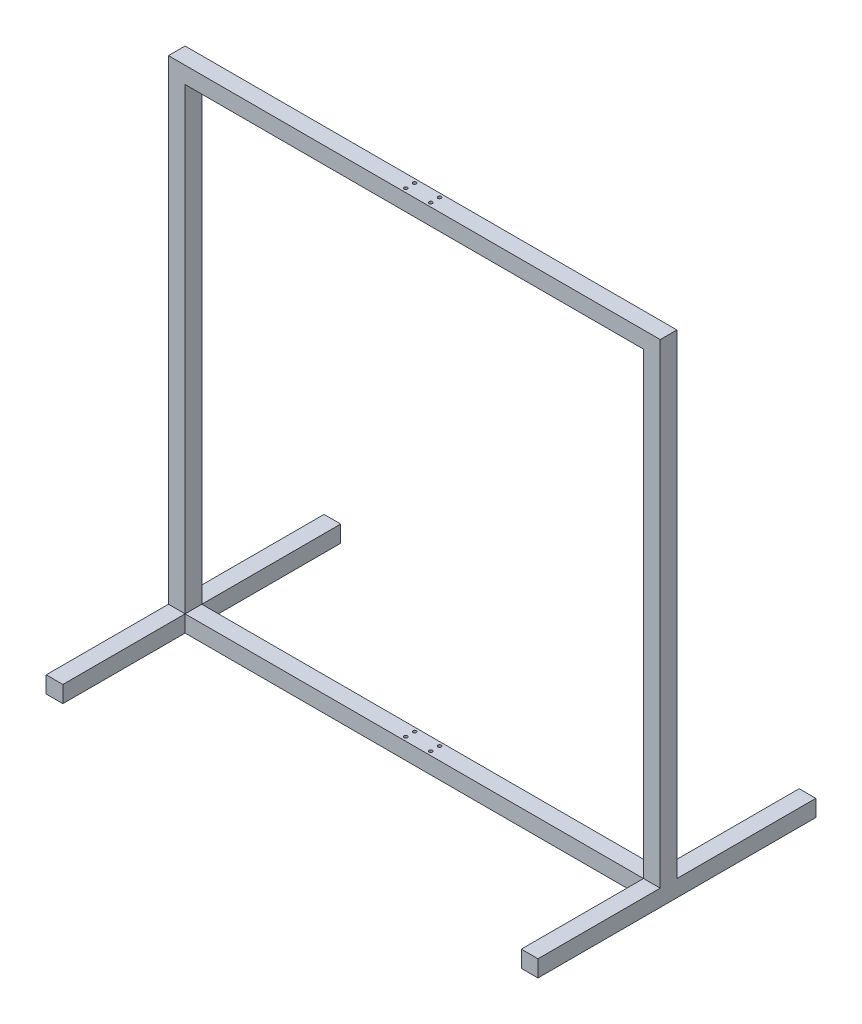
ISO-10303-21;
HEADER;
FILE_DESCRIPTION(('STEP AP214'),'2;1');
FILE_NAME('part.step','',(''),(''),'','','');
FILE_SCHEMA(('AUTOMOTIVE_DESIGN { 1 0 10303 214 1 1 1 1 }'));
ENDSEC;
DATA;
#1=APPLICATION_CONTEXT('core data for automotive mechanical design processes');
#2=APPLICATION_PROTOCOL_DEFINITION('international standard','automotive_design',2000,#1);
#3=PRODUCT_CONTEXT('',#1,'mechanical');
#4=PRODUCT('Part','Part','',(#3));
#5=PRODUCT_RELATED_PRODUCT_CATEGORY('part','',(#4));
#6=PRODUCT_DEFINITION_FORMATION('','',#4);
#7=PRODUCT_DEFINITION_CONTEXT('part definition',#1,'design');
#8=PRODUCT_DEFINITION('design','',#6,#7);
#9=PRODUCT_DEFINITION_SHAPE('','',#8);
#10=(LENGTH_UNIT() NAMED_UNIT(*) SI_UNIT(.MILLI.,.METRE.));
#11=(NAMED_UNIT(*) PLANE_ANGLE_UNIT() SI_UNIT($,.RADIAN.));
#12=(NAMED_UNIT(*) SI_UNIT($,.STERADIAN.) SOLID_ANGLE_UNIT());
#13=UNCERTAINTY_MEASURE_WITH_UNIT(LENGTH_MEASURE(1.E-05),#10,'distance_accuracy_value','');
#14=(GEOMETRIC_REPRESENTATION_CONTEXT(3) GLOBAL_UNCERTAINTY_ASSIGNED_CONTEXT((#13)) GLOBAL_UNIT_ASSIGNED_CONTEXT((#10,
#11,#12)) REPRESENTATION_CONTEXT('',''));
#15=CARTESIAN_POINT('',(0.,0.,0.));
#16=DIRECTION('',(0.,0.,1.));
#17=DIRECTION('',(1.,0.,0.));
#18=AXIS2_PLACEMENT_3D('',#15,#16,#17);
#19=CARTESIAN_POINT('',(-825.,825.,60.));
#20=DIRECTION('',(-1.,0.,0.));
#21=DIRECTION('',(0.,-1.,0.));
#22=AXIS2_PLACEMENT_3D('',#19,#20,#21);
#23=PLANE('',#22);
#24=DIRECTION('',(0.,-1.,0.));
#25=VECTOR('',#24,1.);
#26=CARTESIAN_POINT('',(-825.,-825.,60.));
#27=LINE('',#26,#25);
#28=CARTESIAN_POINT('',(-825.,-825.,60.));
#29=VERTEX_POINT('',#28);
#30=CARTESIAN_POINT('',(-825.,-885.,60.));
#31=VERTEX_POINT('',#30);
#32=EDGE_CURVE('E204',#29,#31,#27,.T.);
#33=ORIENTED_EDGE('',*,*,#32,.F.);
#34=DIRECTION('',(0.,0.,-1.));
#35=VECTOR('',#34,1.);
#36=CARTESIAN_POINT('',(-825.,-825.,500.));
#37=LINE('',#36,#35);
#38=CARTESIAN_POINT('',(-825.,-825.,500.));
#39=VERTEX_POINT('',#38);
#40=EDGE_CURVE('E171',#39,#29,#37,.T.);
#41=ORIENTED_EDGE('',*,*,#40,.F.);
#42=DIRECTION('',(0.,1.,0.));
#43=VECTOR('',#42,1.);
#44=CARTESIAN_POINT('',(-825.,-885.,500.));
#45=LINE('',#44,#43);
#46=CARTESIAN_POINT('',(-825.,-885.,500.));
#47=VERTEX_POINT('',#46);
#48=EDGE_CURVE('E273',#47,#39,#45,.T.);
#49=ORIENTED_EDGE('',*,*,#48,.F.);
#50=DIRECTION('',(0.,0.,-1.));
#51=VECTOR('',#50,1.);
#52=CARTESIAN_POINT('',(-825.,-885.,60.));
#53=LINE('',#52,#51);
#54=EDGE_CURVE('E63',#47,#31,#53,.T.);
#55=ORIENTED_EDGE('',*,*,#54,.T.);
#56=EDGE_LOOP('',(#33,#41,#49,#55));
#57=FACE_BOUND('',#56,.T.);
#58=ADVANCED_FACE('F38',(#57),#23,.F.);
#59=DIRECTION('',(0.,0.,1.));
#60=VECTOR('',#59,1.);
#61=CARTESIAN_POINT('',(-825.,-825.,0.));
#62=LINE('',#61,#60);
#63=CARTESIAN_POINT('',(-825.,-825.,0.));
#64=VERTEX_POINT('',#63);
#65=EDGE_CURVE('E197',#64,#29,#62,.T.);
#66=ORIENTED_EDGE('',*,*,#65,.F.);
#67=DIRECTION('',(0.,1.,0.));
#68=VECTOR('',#67,1.);
#69=CARTESIAN_POINT('',(-825.,825.,0.));
#70=LINE('',#69,#68);
#71=CARTESIAN_POINT('',(-825.,825.,0.));
#72=VERTEX_POINT('',#71);
#73=EDGE_CURVE('E184',#64,#72,#70,.T.);
#74=ORIENTED_EDGE('',*,*,#73,.T.);
#75=DIRECTION('',(0.,0.,-1.));
#76=VECTOR('',#75,1.);
#77=CARTESIAN_POINT('',(-825.,825.,60.));
#78=LINE('',#77,#76);
#79=CARTESIAN_POINT('',(-825.,825.,60.));
#80=VERTEX_POINT('',#79);
#81=EDGE_CURVE('E316',#80,#72,#78,.T.);
#82=ORIENTED_EDGE('',*,*,#81,.F.);
#83=DIRECTION('',(0.,1.,0.));
#84=VECTOR('',#83,1.);
#85=CARTESIAN_POINT('',(-825.,-825.,60.));
#86=LINE('',#85,#84);
#87=EDGE_CURVE('E200',#29,#80,#86,.T.);
#88=ORIENTED_EDGE('',*,*,#87,.F.);
#89=EDGE_LOOP('',(#66,#74,#82,#88));
#90=FACE_BOUND('',#89,.T.);
#91=ADVANCED_FACE('F199',(#90),#23,.F.);
#92=DIRECTION('',(0.,1.,0.));
#93=VECTOR('',#92,1.);
#94=CARTESIAN_POINT('',(-825.,-885.,0.));
#95=LINE('',#94,#93);
#96=CARTESIAN_POINT('',(-825.,-885.,0.));
#97=VERTEX_POINT('',#96);
#98=EDGE_CURVE('E55',#97,#64,#95,.T.);
#99=ORIENTED_EDGE('',*,*,#98,.F.);
#100=CARTESIAN_POINT('',(-825.,-885.,-500.));
#101=VERTEX_POINT('',#100);
#102=EDGE_CURVE('E318',#97,#101,#53,.T.);
#103=ORIENTED_EDGE('',*,*,#102,.T.);
#104=DIRECTION('',(0.,1.,0.));
#105=VECTOR('',#104,1.);
#106=CARTESIAN_POINT('',(-825.,-885.,-500.));
#107=LINE('',#106,#105);
#108=CARTESIAN_POINT('',(-825.,-825.,-500.));
#109=VERTEX_POINT('',#108);
#110=EDGE_CURVE('E167',#101,#109,#107,.T.);
#111=ORIENTED_EDGE('',*,*,#110,.T.);
#112=EDGE_CURVE('E163',#64,#109,#37,.T.);
#113=ORIENTED_EDGE('',*,*,#112,.F.);
#114=EDGE_LOOP('',(#99,#103,#111,#113));
#115=FACE_BOUND('',#114,.T.);
#116=ADVANCED_FACE('F165',(#115),#23,.F.);
#117=CARTESIAN_POINT('',(825.,825.,60.));
#118=DIRECTION('',(1.,0.,0.));
#119=DIRECTION('',(0.,1.,0.));
#120=AXIS2_PLACEMENT_3D('',#117,#118,#119);
#121=PLANE('',#120);
#122=DIRECTION('',(0.,1.,0.));
#123=VECTOR('',#122,1.);
#124=CARTESIAN_POINT('',(825.,825.,60.));
#125=LINE('',#124,#123);
#126=CARTESIAN_POINT('',(825.,-885.,60.));
#127=VERTEX_POINT('',#126);
#128=CARTESIAN_POINT('',(825.,-825.,60.));
#129=VERTEX_POINT('',#128);
#130=EDGE_CURVE('E226',#127,#129,#125,.T.);
#131=ORIENTED_EDGE('',*,*,#130,.F.);
#132=DIRECTION('',(0.,0.,-1.));
#133=VECTOR('',#132,1.);
#134=CARTESIAN_POINT('',(825.,-885.,60.));
#135=LINE('',#134,#133);
#136=CARTESIAN_POINT('',(825.,-885.,500.));
#137=VERTEX_POINT('',#136);
#138=EDGE_CURVE('E181',#137,#127,#135,.T.);
#139=ORIENTED_EDGE('',*,*,#138,.F.);
#140=DIRECTION('',(0.,-1.,0.));
#141=VECTOR('',#140,1.);
#142=CARTESIAN_POINT('',(825.,-885.,500.));
#143=LINE('',#142,#141);
#144=CARTESIAN_POINT('',(825.,-825.,500.));
#145=VERTEX_POINT('',#144);
#146=EDGE_CURVE('E244',#145,#137,#143,.T.);
#147=ORIENTED_EDGE('',*,*,#146,.F.);
#148=DIRECTION('',(0.,0.,-1.));
#149=VECTOR('',#148,1.);
#150=CARTESIAN_POINT('',(825.,-825.,500.));
#151=LINE('',#150,#149);
#152=EDGE_CURVE('E236',#145,#129,#151,.T.);
#153=ORIENTED_EDGE('',*,*,#152,.T.);
#154=EDGE_LOOP('',(#131,#139,#147,#153));
#155=FACE_BOUND('',#154,.T.);
#156=ADVANCED_FACE('F423',(#155),#121,.F.);
#157=DIRECTION('',(0.,0.,-1.));
#158=VECTOR('',#157,1.);
#159=CARTESIAN_POINT('',(825.,-824.999999999999,60.0000000000183));
#160=LINE('',#159,#158);
#161=CARTESIAN_POINT('',(825.,-825.,0.));
#162=VERTEX_POINT('',#161);
#163=EDGE_CURVE('E11',#129,#162,#160,.T.);
#164=ORIENTED_EDGE('',*,*,#163,.F.);
#165=DIRECTION('',(0.,-1.,0.));
#166=VECTOR('',#165,1.);
#167=CARTESIAN_POINT('',(825.,-825.,60.));
#168=LINE('',#167,#166);
#169=CARTESIAN_POINT('',(825.,825.,60.));
#170=VERTEX_POINT('',#169);
#171=EDGE_CURVE('E291',#170,#129,#168,.T.);
#172=ORIENTED_EDGE('',*,*,#171,.F.);
#173=DIRECTION('',(0.,0.,-1.));
#174=VECTOR('',#173,1.);
#175=CARTESIAN_POINT('',(825.,825.,60.));
#176=LINE('',#175,#174);
#177=CARTESIAN_POINT('',(825.,825.,0.));
#178=VERTEX_POINT('',#177);
#179=EDGE_CURVE('E306',#170,#178,#176,.T.);
#180=ORIENTED_EDGE('',*,*,#179,.T.);
#181=DIRECTION('',(0.,-1.,0.));
#182=VECTOR('',#181,1.);
#183=CARTESIAN_POINT('',(825.,825.,0.));
#184=LINE('',#183,#182);
#185=EDGE_CURVE('E295',#178,#162,#184,.T.);
#186=ORIENTED_EDGE('',*,*,#185,.T.);
#187=EDGE_LOOP('',(#164,#172,#180,#186));
#188=FACE_BOUND('',#187,.T.);
#189=ADVANCED_FACE('F398',(#188),#121,.F.);
#190=DIRECTION('',(0.,-1.,0.));
#191=VECTOR('',#190,1.);
#192=CARTESIAN_POINT('',(825.,825.,0.));
#193=LINE('',#192,#191);
#194=CARTESIAN_POINT('',(825.,-885.,0.));
#195=VERTEX_POINT('',#194);
#196=EDGE_CURVE('E229',#162,#195,#193,.T.);
#197=ORIENTED_EDGE('',*,*,#196,.F.);
#198=CARTESIAN_POINT('',(825.,-825.,-500.));
#199=VERTEX_POINT('',#198);
#200=EDGE_CURVE('E235',#162,#199,#151,.T.);
#201=ORIENTED_EDGE('',*,*,#200,.T.);
#202=DIRECTION('',(0.,-1.,0.));
#203=VECTOR('',#202,1.);
#204=CARTESIAN_POINT('',(825.,-885.,-500.));
#205=LINE('',#204,#203);
#206=CARTESIAN_POINT('',(825.,-885.,-500.));
#207=VERTEX_POINT('',#206);
#208=EDGE_CURVE('E250',#199,#207,#205,.T.);
#209=ORIENTED_EDGE('',*,*,#208,.T.);
#210=EDGE_CURVE('E330',#195,#207,#135,.T.);
#211=ORIENTED_EDGE('',*,*,#210,.F.);
#212=EDGE_LOOP('',(#197,#201,#209,#211));
#213=FACE_BOUND('',#212,.T.);
#214=ADVANCED_FACE('F404',(#213),#121,.F.);
#215=CARTESIAN_POINT('',(0.,0.,60.));
#216=DIRECTION('',(0.,0.,1.));
#217=DIRECTION('',(1.,0.,0.));
#218=AXIS2_PLACEMENT_3D('',#215,#216,#217);
#219=PLANE('',#218);
#220=ORIENTED_EDGE('',*,*,#171,.T.);
#221=DIRECTION('',(1.,0.,0.));
#222=VECTOR('',#221,1.);
#223=CARTESIAN_POINT('',(-1.52655665885957E-12,-824.999999999998,60.));
#224=LINE('',#223,#222);
#225=CARTESIAN_POINT('',(885.,-824.999999999999,60.));
#226=VERTEX_POINT('',#225);
#227=EDGE_CURVE('E263',#129,#226,#224,.T.);
#228=ORIENTED_EDGE('',*,*,#227,.T.);
#229=DIRECTION('',(0.,1.,0.));
#230=VECTOR('',#229,1.);
#231=CARTESIAN_POINT('',(885.,885.,60.));
#232=LINE('',#231,#230);
#233=CARTESIAN_POINT('',(885.,885.,60.));
#234=VERTEX_POINT('',#233);
#235=EDGE_CURVE('E294',#226,#234,#232,.T.);
#236=ORIENTED_EDGE('',*,*,#235,.T.);
#237=DIRECTION('',(-1.,0.,0.));
#238=VECTOR('',#237,1.);
#239=CARTESIAN_POINT('',(-885.,885.,60.));
#240=LINE('',#239,#238);
#241=CARTESIAN_POINT('',(-885.,885.,60.));
#242=VERTEX_POINT('',#241);
#243=EDGE_CURVE('E297',#234,#242,#240,.T.);
#244=ORIENTED_EDGE('',*,*,#243,.T.);
#245=DIRECTION('',(0.,-1.,0.));
#246=VECTOR('',#245,1.);
#247=CARTESIAN_POINT('',(-885.,885.,60.));
#248=LINE('',#247,#246);
#249=CARTESIAN_POINT('',(-885.,-825.,60.));
#250=VERTEX_POINT('',#249);
#251=EDGE_CURVE('E299',#242,#250,#248,.T.);
#252=ORIENTED_EDGE('',*,*,#251,.T.);
#253=DIRECTION('',(1.,0.,0.));
#254=VECTOR('',#253,1.);
#255=CARTESIAN_POINT('',(0.,-825.,60.));
#256=LINE('',#255,#254);
#257=EDGE_CURVE('E287',#250,#29,#256,.T.);
#258=ORIENTED_EDGE('',*,*,#257,.T.);
#259=ORIENTED_EDGE('',*,*,#87,.T.);
#260=DIRECTION('',(1.,0.,0.));
#261=VECTOR('',#260,1.);
#262=CARTESIAN_POINT('',(-825.,825.,60.));
#263=LINE('',#262,#261);
#264=EDGE_CURVE('E303',#80,#170,#263,.T.);
#265=ORIENTED_EDGE('',*,*,#264,.T.);
#266=EDGE_LOOP('',(#220,#228,#236,#244,#252,#258,#259,#265));
#267=FACE_BOUND('',#266,.T.);
#268=ADVANCED_FACE('F389',(#267),#219,.T.);
#269=CARTESIAN_POINT('',(0.,0.,0.));
#270=DIRECTION('',(0.,0.,1.));
#271=DIRECTION('',(1.,0.,0.));
#272=AXIS2_PLACEMENT_3D('',#269,#270,#271);
#273=PLANE('',#272);
#274=DIRECTION('',(1.,0.,0.));
#275=VECTOR('',#274,1.);
#276=CARTESIAN_POINT('',(-1.52655665885957E-12,-824.999999999998,0.));
#277=LINE('',#276,#275);
#278=CARTESIAN_POINT('',(885.,-825.,0.));
#279=VERTEX_POINT('',#278);
#280=EDGE_CURVE('E253',#162,#279,#277,.T.);
#281=ORIENTED_EDGE('',*,*,#280,.F.);
#282=ORIENTED_EDGE('',*,*,#185,.F.);
#283=DIRECTION('',(1.,0.,0.));
#284=VECTOR('',#283,1.);
#285=CARTESIAN_POINT('',(-825.,825.,0.));
#286=LINE('',#285,#284);
#287=EDGE_CURVE('E189',#72,#178,#286,.T.);
#288=ORIENTED_EDGE('',*,*,#287,.F.);
#289=ORIENTED_EDGE('',*,*,#73,.F.);
#290=DIRECTION('',(1.,0.,0.));
#291=VECTOR('',#290,1.);
#292=CARTESIAN_POINT('',(0.,-825.,0.));
#293=LINE('',#292,#291);
#294=CARTESIAN_POINT('',(-885.,-825.,0.));
#295=VERTEX_POINT('',#294);
#296=EDGE_CURVE('E47',#295,#64,#293,.T.);
#297=ORIENTED_EDGE('',*,*,#296,.F.);
#298=DIRECTION('',(0.,-1.,0.));
#299=VECTOR('',#298,1.);
#300=CARTESIAN_POINT('',(-885.,885.,0.));
#301=LINE('',#300,#299);
#302=CARTESIAN_POINT('',(-885.,885.,0.));
#303=VERTEX_POINT('',#302);
#304=EDGE_CURVE('E193',#303,#295,#301,.T.);
#305=ORIENTED_EDGE('',*,*,#304,.F.);
#306=DIRECTION('',(-1.,0.,0.));
#307=VECTOR('',#306,1.);
#308=CARTESIAN_POINT('',(-885.,885.,0.));
#309=LINE('',#308,#307);
#310=CARTESIAN_POINT('',(885.,885.,0.));
#311=VERTEX_POINT('',#310);
#312=EDGE_CURVE('E308',#311,#303,#309,.T.);
#313=ORIENTED_EDGE('',*,*,#312,.F.);
#314=DIRECTION('',(0.,1.,0.));
#315=VECTOR('',#314,1.);
#316=CARTESIAN_POINT('',(885.,885.,0.));
#317=LINE('',#316,#315);
#318=EDGE_CURVE('E290',#279,#311,#317,.T.);
#319=ORIENTED_EDGE('',*,*,#318,.F.);
#320=EDGE_LOOP('',(#281,#282,#288,#289,#297,#305,#313,#319));
#321=FACE_BOUND('',#320,.T.);
#322=ADVANCED_FACE('F187',(#321),#273,.F.);
#323=CARTESIAN_POINT('',(885.,885.,60.));
#324=DIRECTION('',(-1.,0.,0.));
#325=DIRECTION('',(0.,-1.,0.));
#326=AXIS2_PLACEMENT_3D('',#323,#324,#325);
#327=PLANE('',#326);
#328=DIRECTION('',(0.,0.,-1.));
#329=VECTOR('',#328,1.);
#330=CARTESIAN_POINT('',(885.,-885.,60.));
#331=LINE('',#330,#329);
#332=CARTESIAN_POINT('',(885.,-885.,500.));
#333=VERTEX_POINT('',#332);
#334=CARTESIAN_POINT('',(885.,-885.,-500.));
#335=VERTEX_POINT('',#334);
#336=EDGE_CURVE('E328',#333,#335,#331,.T.);
#337=ORIENTED_EDGE('',*,*,#336,.T.);
#338=DIRECTION('',(0.,1.,0.));
#339=VECTOR('',#338,1.);
#340=CARTESIAN_POINT('',(885.,-825.,-500.));
#341=LINE('',#340,#339);
#342=CARTESIAN_POINT('',(885.,-825.,-500.));
#343=VERTEX_POINT('',#342);
#344=EDGE_CURVE('E243',#335,#343,#341,.T.);
#345=ORIENTED_EDGE('',*,*,#344,.T.);
#346=DIRECTION('',(0.,0.,-1.));
#347=VECTOR('',#346,1.);
#348=CARTESIAN_POINT('',(885.,-825.,500.));
#349=LINE('',#348,#347);
#350=EDGE_CURVE('E231',#279,#343,#349,.T.);
#351=ORIENTED_EDGE('',*,*,#350,.F.);
#352=ORIENTED_EDGE('',*,*,#318,.T.);
#353=DIRECTION('',(0.,0.,-1.));
#354=VECTOR('',#353,1.);
#355=CARTESIAN_POINT('',(885.,885.,60.));
#356=LINE('',#355,#354);
#357=EDGE_CURVE('E325',#234,#311,#356,.T.);
#358=ORIENTED_EDGE('',*,*,#357,.F.);
#359=ORIENTED_EDGE('',*,*,#235,.F.);
#360=CARTESIAN_POINT('',(885.,-825.,500.));
#361=VERTEX_POINT('',#360);
#362=EDGE_CURVE('E232',#361,#226,#349,.T.);
#363=ORIENTED_EDGE('',*,*,#362,.F.);
#364=DIRECTION('',(0.,1.,0.));
#365=VECTOR('',#364,1.);
#366=CARTESIAN_POINT('',(885.,-825.,500.));
#367=LINE('',#366,#365);
#368=EDGE_CURVE('E255',#333,#361,#367,.T.);
#369=ORIENTED_EDGE('',*,*,#368,.F.);
#370=EDGE_LOOP('',(#337,#345,#351,#352,#358,#359,#363,#369));
#371=FACE_BOUND('',#370,.T.);
#372=ADVANCED_FACE('F40',(#371),#327,.F.);
#373=CARTESIAN_POINT('',(-885.,885.,60.));
#374=DIRECTION('',(0.,-1.,0.));
#375=DIRECTION('',(0.,0.,-1.));
#376=AXIS2_PLACEMENT_3D('',#373,#374,#375);
#377=PLANE('',#376);
#378=CARTESIAN_POINT('',(-45.,885.,14.));
#379=DIRECTION('',(0.,-1.,0.));
#380=DIRECTION('',(0.,0.,-1.));
#381=AXIS2_PLACEMENT_3D('',#378,#379,#380);
#382=CIRCLE('',#381,6.);
#383=CARTESIAN_POINT('',(-45.,885.,8.00000000000004));
#384=VERTEX_POINT('',#383);
#385=EDGE_CURVE('E205',#384,#384,#382,.F.);
#386=ORIENTED_EDGE('',*,*,#385,.F.);
#387=EDGE_LOOP('',(#386));
#388=FACE_BOUND('',#387,.T.);
#389=CARTESIAN_POINT('',(45.,885.,46.0000000000001));
#390=DIRECTION('',(0.,-1.,0.));
#391=DIRECTION('',(0.,0.,-1.));
#392=AXIS2_PLACEMENT_3D('',#389,#390,#391);
#393=CIRCLE('',#392,6.);
#394=CARTESIAN_POINT('',(45.,885.,40.));
#395=VERTEX_POINT('',#394);
#396=EDGE_CURVE('E349',#395,#395,#393,.F.);
#397=ORIENTED_EDGE('',*,*,#396,.F.);
#398=EDGE_LOOP('',(#397));
#399=FACE_BOUND('',#398,.T.);
#400=CARTESIAN_POINT('',(45.,885.,14.0000000000001));
#401=DIRECTION('',(0.,-1.,0.));
#402=DIRECTION('',(0.,0.,-1.));
#403=AXIS2_PLACEMENT_3D('',#400,#401,#402);
#404=CIRCLE('',#403,6.);
#405=CARTESIAN_POINT('',(45.,885.,8.00000000000005));
#406=VERTEX_POINT('',#405);
#407=EDGE_CURVE('E345',#406,#406,#404,.F.);
#408=ORIENTED_EDGE('',*,*,#407,.F.);
#409=EDGE_LOOP('',(#408));
#410=FACE_BOUND('',#409,.T.);
#411=CARTESIAN_POINT('',(-45.,885.,46.));
#412=DIRECTION('',(0.,-1.,0.));
#413=DIRECTION('',(0.,0.,-1.));
#414=AXIS2_PLACEMENT_3D('',#411,#412,#413);
#415=CIRCLE('',#414,6.);
#416=CARTESIAN_POINT('',(-45.,885.,40.));
#417=VERTEX_POINT('',#416);
#418=EDGE_CURVE('E341',#417,#417,#415,.F.);
#419=ORIENTED_EDGE('',*,*,#418,.F.);
#420=EDGE_LOOP('',(#419));
#421=FACE_BOUND('',#420,.T.);
#422=ORIENTED_EDGE('',*,*,#312,.T.);
#423=DIRECTION('',(0.,0.,-1.));
#424=VECTOR('',#423,1.);
#425=CARTESIAN_POINT('',(-885.,885.,60.));
#426=LINE('',#425,#424);
#427=EDGE_CURVE('E322',#242,#303,#426,.T.);
#428=ORIENTED_EDGE('',*,*,#427,.F.);
#429=ORIENTED_EDGE('',*,*,#243,.F.);
#430=ORIENTED_EDGE('',*,*,#357,.T.);
#431=EDGE_LOOP('',(#422,#428,#429,#430));
#432=FACE_BOUND('',#431,.T.);
#433=ADVANCED_FACE('F369',(#388,#399,#410,#421,#432),#377,.F.);
#434=CARTESIAN_POINT('',(-885.,885.,60.));
#435=DIRECTION('',(1.,0.,0.));
#436=DIRECTION('',(0.,1.,0.));
#437=AXIS2_PLACEMENT_3D('',#434,#435,#436);
#438=PLANE('',#437);
#439=DIRECTION('',(0.,0.,-1.));
#440=VECTOR('',#439,1.);
#441=CARTESIAN_POINT('',(-885.,-885.,60.));
#442=LINE('',#441,#440);
#443=CARTESIAN_POINT('',(-885.,-885.,500.));
#444=VERTEX_POINT('',#443);
#445=CARTESIAN_POINT('',(-885.,-885.,-500.));
#446=VERTEX_POINT('',#445);
#447=EDGE_CURVE('E320',#444,#446,#442,.T.);
#448=ORIENTED_EDGE('',*,*,#447,.F.);
#449=DIRECTION('',(0.,-1.,0.));
#450=VECTOR('',#449,1.);
#451=CARTESIAN_POINT('',(-885.,-825.,500.));
#452=LINE('',#451,#450);
#453=CARTESIAN_POINT('',(-885.,-825.,500.));
#454=VERTEX_POINT('',#453);
#455=EDGE_CURVE('E266',#454,#444,#452,.T.);
#456=ORIENTED_EDGE('',*,*,#455,.F.);
#457=DIRECTION('',(0.,0.,-1.));
#458=VECTOR('',#457,1.);
#459=CARTESIAN_POINT('',(-885.,-825.,500.));
#460=LINE('',#459,#458);
#461=EDGE_CURVE('E172',#454,#250,#460,.T.);
#462=ORIENTED_EDGE('',*,*,#461,.T.);
#463=ORIENTED_EDGE('',*,*,#251,.F.);
#464=ORIENTED_EDGE('',*,*,#427,.T.);
#465=ORIENTED_EDGE('',*,*,#304,.T.);
#466=CARTESIAN_POINT('',(-885.,-825.,-500.));
#467=VERTEX_POINT('',#466);
#468=EDGE_CURVE('E177',#295,#467,#460,.T.);
#469=ORIENTED_EDGE('',*,*,#468,.T.);
#470=DIRECTION('',(0.,-1.,0.));
#471=VECTOR('',#470,1.);
#472=CARTESIAN_POINT('',(-885.,-825.,-500.));
#473=LINE('',#472,#471);
#474=EDGE_CURVE('E265',#467,#446,#473,.T.);
#475=ORIENTED_EDGE('',*,*,#474,.T.);
#476=EDGE_LOOP('',(#448,#456,#462,#463,#464,#465,#469,#475));
#477=FACE_BOUND('',#476,.T.);
#478=ADVANCED_FACE('F372',(#477),#438,.F.);
#479=CARTESIAN_POINT('',(-885.,-885.,60.));
#480=DIRECTION('',(0.,1.,0.));
#481=DIRECTION('',(0.,0.,1.));
#482=AXIS2_PLACEMENT_3D('',#479,#480,#481);
#483=PLANE('',#482);
#484=CARTESIAN_POINT('',(-45.,-885.,14.));
#485=DIRECTION('',(0.,-1.,0.));
#486=DIRECTION('',(0.,0.,-1.));
#487=AXIS2_PLACEMENT_3D('',#484,#485,#486);
#488=CIRCLE('',#487,6.);
#489=CARTESIAN_POINT('',(-45.,-885.,8.00000000000004));
#490=VERTEX_POINT('',#489);
#491=EDGE_CURVE('E529',#490,#490,#488,.T.);
#492=ORIENTED_EDGE('',*,*,#491,.F.);
#493=EDGE_LOOP('',(#492));
#494=FACE_BOUND('',#493,.T.);
#495=CARTESIAN_POINT('',(45.,-885.,46.0000000000001));
#496=DIRECTION('',(0.,-1.,0.));
#497=DIRECTION('',(0.,0.,-1.));
#498=AXIS2_PLACEMENT_3D('',#495,#496,#497);
#499=CIRCLE('',#498,6.);
#500=CARTESIAN_POINT('',(45.,-885.,40.));
#501=VERTEX_POINT('',#500);
#502=EDGE_CURVE('E526',#501,#501,#499,.T.);
#503=ORIENTED_EDGE('',*,*,#502,.F.);
#504=EDGE_LOOP('',(#503));
#505=FACE_BOUND('',#504,.T.);
#506=CARTESIAN_POINT('',(45.,-885.,14.0000000000001));
#507=DIRECTION('',(0.,-1.,0.));
#508=DIRECTION('',(0.,0.,-1.));
#509=AXIS2_PLACEMENT_3D('',#506,#507,#508);
#510=CIRCLE('',#509,6.);
#511=CARTESIAN_POINT('',(45.,-885.,8.00000000000005));
#512=VERTEX_POINT('',#511);
#513=EDGE_CURVE('E519',#512,#512,#510,.T.);
#514=ORIENTED_EDGE('',*,*,#513,.F.);
#515=EDGE_LOOP('',(#514));
#516=FACE_BOUND('',#515,.T.);
#517=CARTESIAN_POINT('',(-45.,-885.,46.));
#518=DIRECTION('',(0.,-1.,0.));
#519=DIRECTION('',(0.,0.,-1.));
#520=AXIS2_PLACEMENT_3D('',#517,#518,#519);
#521=CIRCLE('',#520,6.);
#522=CARTESIAN_POINT('',(-45.,-885.,40.));
#523=VERTEX_POINT('',#522);
#524=EDGE_CURVE('E337',#523,#523,#521,.T.);
#525=ORIENTED_EDGE('',*,*,#524,.F.);
#526=EDGE_LOOP('',(#525));
#527=FACE_BOUND('',#526,.T.);
#528=ORIENTED_EDGE('',*,*,#138,.T.);
#529=DIRECTION('',(-1.,0.,0.));
#530=VECTOR('',#529,1.);
#531=CARTESIAN_POINT('',(877.999999999997,-885.,60.));
#532=LINE('',#531,#530);
#533=EDGE_CURVE('E222',#127,#31,#532,.T.);
#534=ORIENTED_EDGE('',*,*,#533,.T.);
#535=ORIENTED_EDGE('',*,*,#54,.F.);
#536=DIRECTION('',(1.,0.,0.));
#537=VECTOR('',#536,1.);
#538=CARTESIAN_POINT('',(-885.,-885.,500.));
#539=LINE('',#538,#537);
#540=EDGE_CURVE('E269',#444,#47,#539,.T.);
#541=ORIENTED_EDGE('',*,*,#540,.F.);
#542=ORIENTED_EDGE('',*,*,#447,.T.);
#543=DIRECTION('',(1.,0.,0.));
#544=VECTOR('',#543,1.);
#545=CARTESIAN_POINT('',(-885.,-885.,-500.));
#546=LINE('',#545,#544);
#547=EDGE_CURVE('E279',#446,#101,#546,.T.);
#548=ORIENTED_EDGE('',*,*,#547,.T.);
#549=ORIENTED_EDGE('',*,*,#102,.F.);
#550=DIRECTION('',(-1.,0.,0.));
#551=VECTOR('',#550,1.);
#552=CARTESIAN_POINT('',(877.999999999997,-885.,0.));
#553=LINE('',#552,#551);
#554=EDGE_CURVE('E212',#195,#97,#553,.T.);
#555=ORIENTED_EDGE('',*,*,#554,.F.);
#556=ORIENTED_EDGE('',*,*,#210,.T.);
#557=DIRECTION('',(1.,0.,0.));
#558=VECTOR('',#557,1.);
#559=CARTESIAN_POINT('',(885.,-885.,-500.));
#560=LINE('',#559,#558);
#561=EDGE_CURVE('E247',#207,#335,#560,.T.);
#562=ORIENTED_EDGE('',*,*,#561,.T.);
#563=ORIENTED_EDGE('',*,*,#336,.F.);
#564=DIRECTION('',(1.,0.,0.));
#565=VECTOR('',#564,1.);
#566=CARTESIAN_POINT('',(885.,-885.,500.));
#567=LINE('',#566,#565);
#568=EDGE_CURVE('E257',#137,#333,#567,.T.);
#569=ORIENTED_EDGE('',*,*,#568,.F.);
#570=EDGE_LOOP('',(#528,#534,#535,#541,#542,#548,#549,#555,#556,#562,#563,#569));
#571=FACE_BOUND('',#570,.T.);
#572=ADVANCED_FACE('F406',(#494,#505,#516,#527,#571),#483,.F.);
#573=CARTESIAN_POINT('',(-825.,825.,60.));
#574=DIRECTION('',(0.,1.,0.));
#575=DIRECTION('',(0.,0.,1.));
#576=AXIS2_PLACEMENT_3D('',#573,#574,#575);
#577=PLANE('',#576);
#578=CARTESIAN_POINT('',(-45.,825.,14.));
#579=DIRECTION('',(0.,1.,0.));
#580=DIRECTION('',(0.,0.,1.));
#581=AXIS2_PLACEMENT_3D('',#578,#579,#580);
#582=CIRCLE('',#581,6.);
#583=CARTESIAN_POINT('',(-45.,825.,20.0000000000001));
#584=VERTEX_POINT('',#583);
#585=EDGE_CURVE('E361',#584,#584,#582,.F.);
#586=ORIENTED_EDGE('',*,*,#585,.F.);
#587=EDGE_LOOP('',(#586));
#588=FACE_BOUND('',#587,.T.);
#589=CARTESIAN_POINT('',(45.,825.,46.0000000000001));
#590=DIRECTION('',(0.,1.,0.));
#591=DIRECTION('',(0.,0.,1.));
#592=AXIS2_PLACEMENT_3D('',#589,#590,#591);
#593=CIRCLE('',#592,6.);
#594=CARTESIAN_POINT('',(45.,825.,52.0000000000001));
#595=VERTEX_POINT('',#594);
#596=EDGE_CURVE('E344',#595,#595,#593,.F.);
#597=ORIENTED_EDGE('',*,*,#596,.F.);
#598=EDGE_LOOP('',(#597));
#599=FACE_BOUND('',#598,.T.);
#600=CARTESIAN_POINT('',(45.,825.,14.0000000000001));
#601=DIRECTION('',(0.,1.,0.));
#602=DIRECTION('',(0.,0.,1.));
#603=AXIS2_PLACEMENT_3D('',#600,#601,#602);
#604=CIRCLE('',#603,6.);
#605=CARTESIAN_POINT('',(45.,825.,20.0000000000001));
#606=VERTEX_POINT('',#605);
#607=EDGE_CURVE('E340',#606,#606,#604,.F.);
#608=ORIENTED_EDGE('',*,*,#607,.F.);
#609=EDGE_LOOP('',(#608));
#610=FACE_BOUND('',#609,.T.);
#611=CARTESIAN_POINT('',(-45.,825.,46.));
#612=DIRECTION('',(0.,1.,0.));
#613=DIRECTION('',(0.,0.,1.));
#614=AXIS2_PLACEMENT_3D('',#611,#612,#613);
#615=CIRCLE('',#614,6.);
#616=CARTESIAN_POINT('',(-45.,825.,52.));
#617=VERTEX_POINT('',#616);
#618=EDGE_CURVE('E336',#617,#617,#615,.F.);
#619=ORIENTED_EDGE('',*,*,#618,.F.);
#620=EDGE_LOOP('',(#619));
#621=FACE_BOUND('',#620,.T.);
#622=ORIENTED_EDGE('',*,*,#287,.T.);
#623=ORIENTED_EDGE('',*,*,#179,.F.);
#624=ORIENTED_EDGE('',*,*,#264,.F.);
#625=ORIENTED_EDGE('',*,*,#81,.T.);
#626=EDGE_LOOP('',(#622,#623,#624,#625));
#627=FACE_BOUND('',#626,.T.);
#628=ADVANCED_FACE('F474',(#588,#599,#610,#621,#627),#577,.F.);
#629=CARTESIAN_POINT('',(0.,0.,-500.));
#630=DIRECTION('',(0.,0.,1.));
#631=DIRECTION('',(1.,0.,0.));
#632=AXIS2_PLACEMENT_3D('',#629,#630,#631);
#633=PLANE('',#632);
#634=ORIENTED_EDGE('',*,*,#474,.F.);
#635=DIRECTION('',(-1.,0.,0.));
#636=VECTOR('',#635,1.);
#637=CARTESIAN_POINT('',(-885.,-825.,-500.));
#638=LINE('',#637,#636);
#639=EDGE_CURVE('E270',#109,#467,#638,.T.);
#640=ORIENTED_EDGE('',*,*,#639,.F.);
#641=ORIENTED_EDGE('',*,*,#110,.F.);
#642=ORIENTED_EDGE('',*,*,#547,.F.);
#643=EDGE_LOOP('',(#634,#640,#641,#642));
#644=FACE_BOUND('',#643,.T.);
#645=ADVANCED_FACE('F412',(#644),#633,.F.);
#646=CARTESIAN_POINT('',(-885.,-825.,500.));
#647=DIRECTION('',(0.,-1.,0.));
#648=DIRECTION('',(0.,0.,-1.));
#649=AXIS2_PLACEMENT_3D('',#646,#647,#648);
#650=PLANE('',#649);
#651=ORIENTED_EDGE('',*,*,#468,.F.);
#652=ORIENTED_EDGE('',*,*,#296,.T.);
#653=ORIENTED_EDGE('',*,*,#112,.T.);
#654=ORIENTED_EDGE('',*,*,#639,.T.);
#655=EDGE_LOOP('',(#651,#652,#653,#654));
#656=FACE_BOUND('',#655,.T.);
#657=ADVANCED_FACE('F176',(#656),#650,.F.);
#658=ORIENTED_EDGE('',*,*,#257,.F.);
#659=ORIENTED_EDGE('',*,*,#461,.F.);
#660=DIRECTION('',(-1.,0.,0.));
#661=VECTOR('',#660,1.);
#662=CARTESIAN_POINT('',(-885.,-825.,500.));
#663=LINE('',#662,#661);
#664=EDGE_CURVE('E275',#39,#454,#663,.T.);
#665=ORIENTED_EDGE('',*,*,#664,.F.);
#666=ORIENTED_EDGE('',*,*,#40,.T.);
#667=EDGE_LOOP('',(#658,#659,#665,#666));
#668=FACE_BOUND('',#667,.T.);
#669=ADVANCED_FACE('F418',(#668),#650,.F.);
#670=CARTESIAN_POINT('',(0.,0.,500.));
#671=DIRECTION('',(0.,0.,1.));
#672=DIRECTION('',(1.,0.,0.));
#673=AXIS2_PLACEMENT_3D('',#670,#671,#672);
#674=PLANE('',#673);
#675=ORIENTED_EDGE('',*,*,#455,.T.);
#676=ORIENTED_EDGE('',*,*,#540,.T.);
#677=ORIENTED_EDGE('',*,*,#48,.T.);
#678=ORIENTED_EDGE('',*,*,#664,.T.);
#679=EDGE_LOOP('',(#675,#676,#677,#678));
#680=FACE_BOUND('',#679,.T.);
#681=ADVANCED_FACE('F414',(#680),#674,.T.);
#682=CARTESIAN_POINT('',(0.,0.,-500.));
#683=DIRECTION('',(0.,0.,-1.));
#684=DIRECTION('',(-1.,0.,0.));
#685=AXIS2_PLACEMENT_3D('',#682,#683,#684);
#686=PLANE('',#685);
#687=ORIENTED_EDGE('',*,*,#208,.F.);
#688=DIRECTION('',(-1.,0.,0.));
#689=VECTOR('',#688,1.);
#690=CARTESIAN_POINT('',(825.,-825.,-500.));
#691=LINE('',#690,#689);
#692=EDGE_CURVE('E240',#343,#199,#691,.T.);
#693=ORIENTED_EDGE('',*,*,#692,.F.);
#694=ORIENTED_EDGE('',*,*,#344,.F.);
#695=ORIENTED_EDGE('',*,*,#561,.F.);
#696=EDGE_LOOP('',(#687,#693,#694,#695));
#697=FACE_BOUND('',#696,.T.);
#698=ADVANCED_FACE('F435',(#697),#686,.T.);
#699=CARTESIAN_POINT('',(825.,-825.,500.));
#700=DIRECTION('',(0.,-1.,0.));
#701=DIRECTION('',(1.,0.,0.));
#702=AXIS2_PLACEMENT_3D('',#699,#700,#701);
#703=PLANE('',#702);
#704=ORIENTED_EDGE('',*,*,#200,.F.);
#705=ORIENTED_EDGE('',*,*,#280,.T.);
#706=ORIENTED_EDGE('',*,*,#350,.T.);
#707=ORIENTED_EDGE('',*,*,#692,.T.);
#708=EDGE_LOOP('',(#704,#705,#706,#707));
#709=FACE_BOUND('',#708,.T.);
#710=ADVANCED_FACE('F400',(#709),#703,.F.);
#711=ORIENTED_EDGE('',*,*,#227,.F.);
#712=ORIENTED_EDGE('',*,*,#152,.F.);
#713=DIRECTION('',(-1.,0.,0.));
#714=VECTOR('',#713,1.);
#715=CARTESIAN_POINT('',(825.,-825.,500.));
#716=LINE('',#715,#714);
#717=EDGE_CURVE('E239',#361,#145,#716,.T.);
#718=ORIENTED_EDGE('',*,*,#717,.F.);
#719=ORIENTED_EDGE('',*,*,#362,.T.);
#720=EDGE_LOOP('',(#711,#712,#718,#719));
#721=FACE_BOUND('',#720,.T.);
#722=ADVANCED_FACE('F432',(#721),#703,.F.);
#723=CARTESIAN_POINT('',(0.,0.,500.));
#724=DIRECTION('',(0.,0.,-1.));
#725=DIRECTION('',(-1.,0.,0.));
#726=AXIS2_PLACEMENT_3D('',#723,#724,#725);
#727=PLANE('',#726);
#728=ORIENTED_EDGE('',*,*,#146,.T.);
#729=ORIENTED_EDGE('',*,*,#568,.T.);
#730=ORIENTED_EDGE('',*,*,#368,.T.);
#731=ORIENTED_EDGE('',*,*,#717,.T.);
#732=EDGE_LOOP('',(#728,#729,#730,#731));
#733=FACE_BOUND('',#732,.T.);
#734=ADVANCED_FACE('F429',(#733),#727,.F.);
#735=CARTESIAN_POINT('',(877.999999999997,-825.,0.));
#736=DIRECTION('',(0.,-1.,0.));
#737=DIRECTION('',(0.,0.,-1.));
#738=AXIS2_PLACEMENT_3D('',#735,#736,#737);
#739=PLANE('',#738);
#740=CARTESIAN_POINT('',(-45.,-825.,14.));
#741=DIRECTION('',(0.,-1.,0.));
#742=DIRECTION('',(0.,0.,-1.));
#743=AXIS2_PLACEMENT_3D('',#740,#741,#742);
#744=CIRCLE('',#743,6.);
#745=CARTESIAN_POINT('',(-45.,-825.,8.00000000000004));
#746=VERTEX_POINT('',#745);
#747=EDGE_CURVE('E42',#746,#746,#744,.F.);
#748=ORIENTED_EDGE('',*,*,#747,.F.);
#749=EDGE_LOOP('',(#748));
#750=FACE_BOUND('',#749,.T.);
#751=CARTESIAN_POINT('',(45.,-825.,46.0000000000001));
#752=DIRECTION('',(0.,-1.,0.));
#753=DIRECTION('',(0.,0.,-1.));
#754=AXIS2_PLACEMENT_3D('',#751,#752,#753);
#755=CIRCLE('',#754,6.);
#756=CARTESIAN_POINT('',(45.,-825.,40.));
#757=VERTEX_POINT('',#756);
#758=EDGE_CURVE('E342',#757,#757,#755,.F.);
#759=ORIENTED_EDGE('',*,*,#758,.F.);
#760=EDGE_LOOP('',(#759));
#761=FACE_BOUND('',#760,.T.);
#762=CARTESIAN_POINT('',(45.,-825.,14.0000000000001));
#763=DIRECTION('',(0.,-1.,0.));
#764=DIRECTION('',(0.,0.,-1.));
#765=AXIS2_PLACEMENT_3D('',#762,#763,#764);
#766=CIRCLE('',#765,6.);
#767=CARTESIAN_POINT('',(45.,-825.,8.00000000000005));
#768=VERTEX_POINT('',#767);
#769=EDGE_CURVE('E338',#768,#768,#766,.F.);
#770=ORIENTED_EDGE('',*,*,#769,.F.);
#771=EDGE_LOOP('',(#770));
#772=FACE_BOUND('',#771,.T.);
#773=CARTESIAN_POINT('',(-45.,-825.,46.));
#774=DIRECTION('',(0.,-1.,0.));
#775=DIRECTION('',(0.,0.,-1.));
#776=AXIS2_PLACEMENT_3D('',#773,#774,#775);
#777=CIRCLE('',#776,6.);
#778=CARTESIAN_POINT('',(-45.,-825.,40.));
#779=VERTEX_POINT('',#778);
#780=EDGE_CURVE('E333',#779,#779,#777,.F.);
#781=ORIENTED_EDGE('',*,*,#780,.F.);
#782=EDGE_LOOP('',(#781));
#783=FACE_BOUND('',#782,.T.);
#784=DIRECTION('',(-1.,0.,0.));
#785=VECTOR('',#784,1.);
#786=CARTESIAN_POINT('',(877.999999999997,-824.999999999999,60.));
#787=LINE('',#786,#785);
#788=EDGE_CURVE('E224',#129,#29,#787,.T.);
#789=ORIENTED_EDGE('',*,*,#788,.F.);
#790=ORIENTED_EDGE('',*,*,#163,.T.);
#791=DIRECTION('',(-1.,0.,0.));
#792=VECTOR('',#791,1.);
#793=CARTESIAN_POINT('',(877.999999999997,-825.,0.));
#794=LINE('',#793,#792);
#795=EDGE_CURVE('E208',#162,#64,#794,.T.);
#796=ORIENTED_EDGE('',*,*,#795,.T.);
#797=ORIENTED_EDGE('',*,*,#65,.T.);
#798=EDGE_LOOP('',(#789,#790,#796,#797));
#799=FACE_BOUND('',#798,.T.);
#800=ADVANCED_FACE('F209',(#750,#761,#772,#783,#799),#739,.F.);
#801=CARTESIAN_POINT('',(877.999999999997,-885.,0.));
#802=DIRECTION('',(0.,0.,1.));
#803=DIRECTION('',(1.,0.,0.));
#804=AXIS2_PLACEMENT_3D('',#801,#802,#803);
#805=PLANE('',#804);
#806=ORIENTED_EDGE('',*,*,#795,.F.);
#807=ORIENTED_EDGE('',*,*,#196,.T.);
#808=ORIENTED_EDGE('',*,*,#554,.T.);
#809=ORIENTED_EDGE('',*,*,#98,.T.);
#810=EDGE_LOOP('',(#806,#807,#808,#809));
#811=FACE_BOUND('',#810,.T.);
#812=ADVANCED_FACE('F215',(#811),#805,.F.);
#813=CARTESIAN_POINT('',(877.999999999997,-824.999999999999,60.));
#814=DIRECTION('',(0.,0.,-1.));
#815=DIRECTION('',(-1.,0.,0.));
#816=AXIS2_PLACEMENT_3D('',#813,#814,#815);
#817=PLANE('',#816);
#818=ORIENTED_EDGE('',*,*,#533,.F.);
#819=ORIENTED_EDGE('',*,*,#130,.T.);
#820=ORIENTED_EDGE('',*,*,#788,.T.);
#821=ORIENTED_EDGE('',*,*,#32,.T.);
#822=EDGE_LOOP('',(#818,#819,#820,#821));
#823=FACE_BOUND('',#822,.T.);
#824=ADVANCED_FACE('F421',(#823),#817,.F.);
#825=CARTESIAN_POINT('',(-45.,-885.,46.));
#826=DIRECTION('',(0.,1.,0.));
#827=DIRECTION('',(0.,0.,1.));
#828=AXIS2_PLACEMENT_3D('',#825,#826,#827);
#829=CYLINDRICAL_SURFACE('',#828,6.);
#830=ORIENTED_EDGE('',*,*,#524,.T.);
#831=EDGE_LOOP('',(#830));
#832=FACE_BOUND('',#831,.T.);
#833=ORIENTED_EDGE('',*,*,#780,.T.);
#834=EDGE_LOOP('',(#833));
#835=FACE_BOUND('',#834,.T.);
#836=ADVANCED_FACE('F487',(#832,#835),#829,.F.);
#837=CARTESIAN_POINT('',(45.,-885.,14.0000000000001));
#838=DIRECTION('',(0.,1.,0.));
#839=DIRECTION('',(0.,0.,1.));
#840=AXIS2_PLACEMENT_3D('',#837,#838,#839);
#841=CYLINDRICAL_SURFACE('',#840,6.);
#842=ORIENTED_EDGE('',*,*,#513,.T.);
#843=EDGE_LOOP('',(#842));
#844=FACE_BOUND('',#843,.T.);
#845=ORIENTED_EDGE('',*,*,#769,.T.);
#846=EDGE_LOOP('',(#845));
#847=FACE_BOUND('',#846,.T.);
#848=ADVANCED_FACE('F505',(#844,#847),#841,.F.);
#849=CARTESIAN_POINT('',(45.,-885.,46.0000000000001));
#850=DIRECTION('',(0.,1.,0.));
#851=DIRECTION('',(0.,0.,1.));
#852=AXIS2_PLACEMENT_3D('',#849,#850,#851);
#853=CYLINDRICAL_SURFACE('',#852,6.);
#854=ORIENTED_EDGE('',*,*,#502,.T.);
#855=EDGE_LOOP('',(#854));
#856=FACE_BOUND('',#855,.T.);
#857=ORIENTED_EDGE('',*,*,#758,.T.);
#858=EDGE_LOOP('',(#857));
#859=FACE_BOUND('',#858,.T.);
#860=ADVANCED_FACE('F499',(#856,#859),#853,.F.);
#861=CARTESIAN_POINT('',(-45.,-885.,14.));
#862=DIRECTION('',(0.,1.,0.));
#863=DIRECTION('',(0.,0.,1.));
#864=AXIS2_PLACEMENT_3D('',#861,#862,#863);
#865=CYLINDRICAL_SURFACE('',#864,6.);
#866=ORIENTED_EDGE('',*,*,#491,.T.);
#867=EDGE_LOOP('',(#866));
#868=FACE_BOUND('',#867,.T.);
#869=ORIENTED_EDGE('',*,*,#747,.T.);
#870=EDGE_LOOP('',(#869));
#871=FACE_BOUND('',#870,.T.);
#872=ADVANCED_FACE('F493',(#868,#871),#865,.F.);
#873=ORIENTED_EDGE('',*,*,#618,.T.);
#874=EDGE_LOOP('',(#873));
#875=FACE_BOUND('',#874,.T.);
#876=ORIENTED_EDGE('',*,*,#418,.T.);
#877=EDGE_LOOP('',(#876));
#878=FACE_BOUND('',#877,.T.);
#879=ADVANCED_FACE('F489',(#875,#878),#829,.F.);
#880=ORIENTED_EDGE('',*,*,#607,.T.);
#881=EDGE_LOOP('',(#880));
#882=FACE_BOUND('',#881,.T.);
#883=ORIENTED_EDGE('',*,*,#407,.T.);
#884=EDGE_LOOP('',(#883));
#885=FACE_BOUND('',#884,.T.);
#886=ADVANCED_FACE('F492',(#882,#885),#841,.F.);
#887=ORIENTED_EDGE('',*,*,#596,.T.);
#888=EDGE_LOOP('',(#887));
#889=FACE_BOUND('',#888,.T.);
#890=ORIENTED_EDGE('',*,*,#396,.T.);
#891=EDGE_LOOP('',(#890));
#892=FACE_BOUND('',#891,.T.);
#893=ADVANCED_FACE('F495',(#889,#892),#853,.F.);
#894=ORIENTED_EDGE('',*,*,#585,.T.);
#895=EDGE_LOOP('',(#894));
#896=FACE_BOUND('',#895,.T.);
#897=ORIENTED_EDGE('',*,*,#385,.T.);
#898=EDGE_LOOP('',(#897));
#899=FACE_BOUND('',#898,.T.);
#900=ADVANCED_FACE('F367',(#896,#899),#865,.F.);
#901=CLOSED_SHELL('',(#58,#91,#116,#156,#189,#214,#268,#322,#372,#433,#478,#572,#628,#645,#657,
#669,#681,#698,#710,#722,#734,#800,#812,#824,#836,#848,#860,#872,#879,#886,#893,#900));
#902=MANIFOLD_SOLID_BREP('B2',#901);
#903=ADVANCED_BREP_SHAPE_REPRESENTATION('',(#18,#902),#14);
#904=SHAPE_DEFINITION_REPRESENTATION(#9,#903);
ENDSEC;
END-ISO-10303-21;
